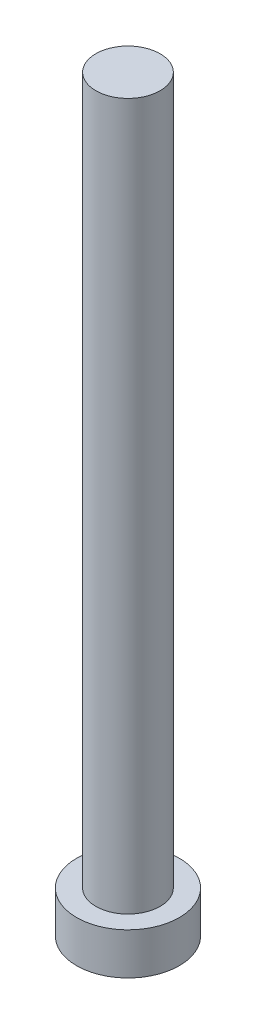
ISO-10303-21;
HEADER;
FILE_DESCRIPTION(('STEP AP214'),'2;1');
FILE_NAME('part.step','',(''),(''),'','','');
FILE_SCHEMA(('AUTOMOTIVE_DESIGN { 1 0 10303 214 1 1 1 1 }'));
ENDSEC;
DATA;
#1=APPLICATION_CONTEXT('core data for automotive mechanical design processes');
#2=APPLICATION_PROTOCOL_DEFINITION('international standard','automotive_design',2000,#1);
#3=PRODUCT_CONTEXT('',#1,'mechanical');
#4=PRODUCT('Part','Part','',(#3));
#5=PRODUCT_RELATED_PRODUCT_CATEGORY('part','',(#4));
#6=PRODUCT_DEFINITION_FORMATION('','',#4);
#7=PRODUCT_DEFINITION_CONTEXT('part definition',#1,'design');
#8=PRODUCT_DEFINITION('design','',#6,#7);
#9=PRODUCT_DEFINITION_SHAPE('','',#8);
#10=(LENGTH_UNIT() NAMED_UNIT(*) SI_UNIT(.MILLI.,.METRE.));
#11=(NAMED_UNIT(*) PLANE_ANGLE_UNIT() SI_UNIT($,.RADIAN.));
#12=(NAMED_UNIT(*) SI_UNIT($,.STERADIAN.) SOLID_ANGLE_UNIT());
#13=UNCERTAINTY_MEASURE_WITH_UNIT(LENGTH_MEASURE(1.E-05),#10,'distance_accuracy_value','');
#14=(GEOMETRIC_REPRESENTATION_CONTEXT(3) GLOBAL_UNCERTAINTY_ASSIGNED_CONTEXT((#13)) GLOBAL_UNIT_ASSIGNED_CONTEXT((#10,
#11,#12)) REPRESENTATION_CONTEXT('',''));
#15=CARTESIAN_POINT('',(0.,0.,0.));
#16=DIRECTION('',(0.,0.,1.));
#17=DIRECTION('',(1.,0.,0.));
#18=AXIS2_PLACEMENT_3D('',#15,#16,#17);
#19=CARTESIAN_POINT('',(0.,1.3,0.));
#20=DIRECTION('',(0.,-1.,0.));
#21=DIRECTION('',(0.,0.,-1.));
#22=AXIS2_PLACEMENT_3D('',#19,#20,#21);
#23=CYLINDRICAL_SURFACE('',#22,1.6);
#24=CARTESIAN_POINT('',(0.,1.3,0.));
#25=DIRECTION('',(0.,1.,0.));
#26=DIRECTION('',(0.,0.,1.));
#27=AXIS2_PLACEMENT_3D('',#24,#25,#26);
#28=CIRCLE('',#27,1.6);
#29=CARTESIAN_POINT('',(0.,1.3,1.6));
#30=VERTEX_POINT('',#29);
#31=EDGE_CURVE('E47',#30,#30,#28,.T.);
#32=ORIENTED_EDGE('',*,*,#31,.F.);
#33=EDGE_LOOP('',(#32));
#34=FACE_BOUND('',#33,.T.);
#35=CARTESIAN_POINT('',(0.,0.,0.));
#36=DIRECTION('',(0.,1.,0.));
#37=DIRECTION('',(0.,0.,1.));
#38=AXIS2_PLACEMENT_3D('',#35,#36,#37);
#39=CIRCLE('',#38,1.6);
#40=CARTESIAN_POINT('',(0.,0.,1.6));
#41=VERTEX_POINT('',#40);
#42=EDGE_CURVE('E42',#41,#41,#39,.T.);
#43=ORIENTED_EDGE('',*,*,#42,.T.);
#44=EDGE_LOOP('',(#43));
#45=FACE_BOUND('',#44,.T.);
#46=ADVANCED_FACE('F39',(#34,#45),#23,.T.);
#47=CARTESIAN_POINT('',(0.,1.3,0.));
#48=DIRECTION('',(0.,1.,0.));
#49=DIRECTION('',(0.,0.,1.));
#50=AXIS2_PLACEMENT_3D('',#47,#48,#49);
#51=PLANE('',#50);
#52=CARTESIAN_POINT('',(0.,1.3,0.));
#53=DIRECTION('',(0.,1.,0.));
#54=DIRECTION('',(0.,0.,1.));
#55=AXIS2_PLACEMENT_3D('',#52,#53,#54);
#56=CIRCLE('',#55,1.);
#57=CARTESIAN_POINT('',(0.,1.3,1.));
#58=VERTEX_POINT('',#57);
#59=EDGE_CURVE('E10',#58,#58,#56,.T.);
#60=ORIENTED_EDGE('',*,*,#59,.F.);
#61=EDGE_LOOP('',(#60));
#62=FACE_BOUND('',#61,.T.);
#63=ORIENTED_EDGE('',*,*,#31,.T.);
#64=EDGE_LOOP('',(#63));
#65=FACE_BOUND('',#64,.T.);
#66=ADVANCED_FACE('F67',(#62,#65),#51,.T.);
#67=CARTESIAN_POINT('',(0.,0.,0.));
#68=DIRECTION('',(0.,1.,0.));
#69=DIRECTION('',(0.,0.,1.));
#70=AXIS2_PLACEMENT_3D('',#67,#68,#69);
#71=PLANE('',#70);
#72=ORIENTED_EDGE('',*,*,#42,.F.);
#73=EDGE_LOOP('',(#72));
#74=FACE_BOUND('',#73,.T.);
#75=ADVANCED_FACE('F64',(#74),#71,.F.);
#76=CARTESIAN_POINT('',(0.,23.3,0.));
#77=DIRECTION('',(0.,-1.,0.));
#78=DIRECTION('',(0.,0.,-1.));
#79=AXIS2_PLACEMENT_3D('',#76,#77,#78);
#80=CYLINDRICAL_SURFACE('',#79,1.);
#81=CARTESIAN_POINT('',(0.,23.3,0.));
#82=DIRECTION('',(0.,1.,0.));
#83=DIRECTION('',(0.,0.,1.));
#84=AXIS2_PLACEMENT_3D('',#81,#82,#83);
#85=CIRCLE('',#84,1.);
#86=CARTESIAN_POINT('',(0.,23.3,1.));
#87=VERTEX_POINT('',#86);
#88=EDGE_CURVE('E54',#87,#87,#85,.T.);
#89=ORIENTED_EDGE('',*,*,#88,.F.);
#90=EDGE_LOOP('',(#89));
#91=FACE_BOUND('',#90,.T.);
#92=ORIENTED_EDGE('',*,*,#59,.T.);
#93=EDGE_LOOP('',(#92));
#94=FACE_BOUND('',#93,.T.);
#95=ADVANCED_FACE('F66',(#91,#94),#80,.T.);
#96=CARTESIAN_POINT('',(0.,23.3,0.));
#97=DIRECTION('',(0.,1.,0.));
#98=DIRECTION('',(0.,0.,1.));
#99=AXIS2_PLACEMENT_3D('',#96,#97,#98);
#100=PLANE('',#99);
#101=ORIENTED_EDGE('',*,*,#88,.T.);
#102=EDGE_LOOP('',(#101));
#103=FACE_BOUND('',#102,.T.);
#104=ADVANCED_FACE('F72',(#103),#100,.T.);
#105=CLOSED_SHELL('',(#46,#66,#75,#95,#104));
#106=MANIFOLD_SOLID_BREP('B2',#105);
#107=ADVANCED_BREP_SHAPE_REPRESENTATION('',(#18,#106),#14);
#108=SHAPE_DEFINITION_REPRESENTATION(#9,#107);
ENDSEC;
END-ISO-10303-21;
